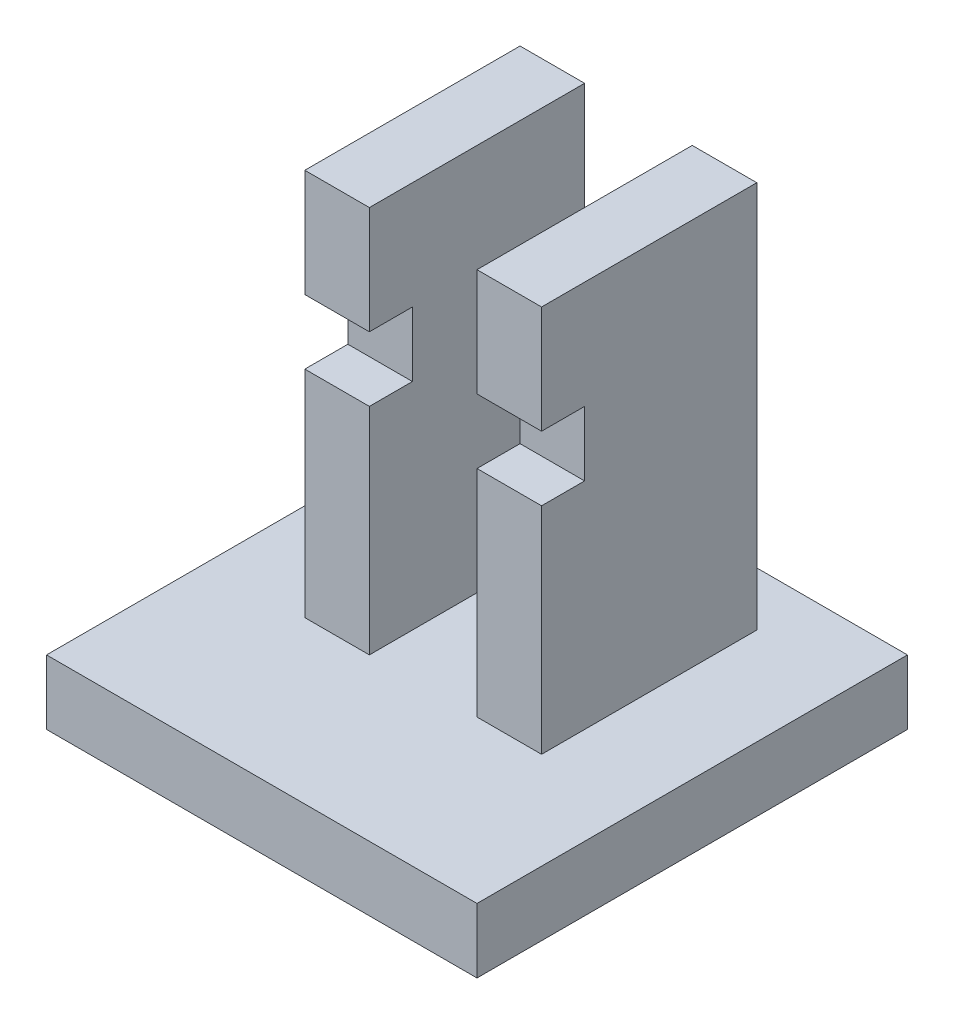
ISO-10303-21;
HEADER;
FILE_DESCRIPTION(('STEP AP214'),'2;1');
FILE_NAME('part.step','',(''),(''),'','','');
FILE_SCHEMA(('AUTOMOTIVE_DESIGN { 1 0 10303 214 1 1 1 1 }'));
ENDSEC;
DATA;
#1=APPLICATION_CONTEXT('core data for automotive mechanical design processes');
#2=APPLICATION_PROTOCOL_DEFINITION('international standard','automotive_design',2000,#1);
#3=PRODUCT_CONTEXT('',#1,'mechanical');
#4=PRODUCT('Part','Part','',(#3));
#5=PRODUCT_RELATED_PRODUCT_CATEGORY('part','',(#4));
#6=PRODUCT_DEFINITION_FORMATION('','',#4);
#7=PRODUCT_DEFINITION_CONTEXT('part definition',#1,'design');
#8=PRODUCT_DEFINITION('design','',#6,#7);
#9=PRODUCT_DEFINITION_SHAPE('','',#8);
#10=(LENGTH_UNIT() NAMED_UNIT(*) SI_UNIT(.MILLI.,.METRE.));
#11=(NAMED_UNIT(*) PLANE_ANGLE_UNIT() SI_UNIT($,.RADIAN.));
#12=(NAMED_UNIT(*) SI_UNIT($,.STERADIAN.) SOLID_ANGLE_UNIT());
#13=UNCERTAINTY_MEASURE_WITH_UNIT(LENGTH_MEASURE(1.E-05),#10,'distance_accuracy_value','');
#14=(GEOMETRIC_REPRESENTATION_CONTEXT(3) GLOBAL_UNCERTAINTY_ASSIGNED_CONTEXT((#13)) GLOBAL_UNIT_ASSIGNED_CONTEXT((#10,
#11,#12)) REPRESENTATION_CONTEXT('',''));
#15=CARTESIAN_POINT('',(0.,0.,0.));
#16=DIRECTION('',(0.,0.,1.));
#17=DIRECTION('',(1.,0.,0.));
#18=AXIS2_PLACEMENT_3D('',#15,#16,#17);
#19=CARTESIAN_POINT('',(-5.5,18.,5.));
#20=DIRECTION('',(0.,0.,-1.));
#21=DIRECTION('',(-1.,0.,0.));
#22=AXIS2_PLACEMENT_3D('',#19,#20,#21);
#23=PLANE('',#22);
#24=DIRECTION('',(0.,-1.,0.));
#25=VECTOR('',#24,1.);
#26=CARTESIAN_POINT('',(-5.5,18.,5.));
#27=LINE('',#26,#25);
#28=CARTESIAN_POINT('',(-5.5,18.,5.));
#29=VERTEX_POINT('',#28);
#30=CARTESIAN_POINT('',(-5.5,13.,5.));
#31=VERTEX_POINT('',#30);
#32=EDGE_CURVE('E303',#29,#31,#27,.T.);
#33=ORIENTED_EDGE('',*,*,#32,.T.);
#34=DIRECTION('',(-1.,0.,0.));
#35=VECTOR('',#34,1.);
#36=CARTESIAN_POINT('',(-5.5,13.,5.));
#37=LINE('',#36,#35);
#38=CARTESIAN_POINT('',(-2.5,13.,5.));
#39=VERTEX_POINT('',#38);
#40=EDGE_CURVE('E339',#39,#31,#37,.T.);
#41=ORIENTED_EDGE('',*,*,#40,.F.);
#42=DIRECTION('',(0.,-1.,0.));
#43=VECTOR('',#42,1.);
#44=CARTESIAN_POINT('',(-2.5,18.,5.));
#45=LINE('',#44,#43);
#46=CARTESIAN_POINT('',(-2.5,18.,5.));
#47=VERTEX_POINT('',#46);
#48=EDGE_CURVE('E300',#47,#39,#45,.T.);
#49=ORIENTED_EDGE('',*,*,#48,.F.);
#50=DIRECTION('',(1.,0.,0.));
#51=VECTOR('',#50,1.);
#52=CARTESIAN_POINT('',(-5.5,18.,5.));
#53=LINE('',#52,#51);
#54=EDGE_CURVE('E288',#29,#47,#53,.T.);
#55=ORIENTED_EDGE('',*,*,#54,.F.);
#56=EDGE_LOOP('',(#33,#41,#49,#55));
#57=FACE_BOUND('',#56,.T.);
#58=ADVANCED_FACE('F35',(#57),#23,.F.);
#59=CARTESIAN_POINT('',(2.5,18.,5.));
#60=DIRECTION('',(0.,0.,-1.));
#61=DIRECTION('',(-1.,0.,0.));
#62=AXIS2_PLACEMENT_3D('',#59,#60,#61);
#63=PLANE('',#62);
#64=DIRECTION('',(0.,-1.,0.));
#65=VECTOR('',#64,1.);
#66=CARTESIAN_POINT('',(2.5,18.,5.));
#67=LINE('',#66,#65);
#68=CARTESIAN_POINT('',(2.5,18.,5.));
#69=VERTEX_POINT('',#68);
#70=CARTESIAN_POINT('',(2.5,13.,5.));
#71=VERTEX_POINT('',#70);
#72=EDGE_CURVE('E241',#69,#71,#67,.T.);
#73=ORIENTED_EDGE('',*,*,#72,.T.);
#74=CARTESIAN_POINT('',(5.5,13.,5.));
#75=VERTEX_POINT('',#74);
#76=EDGE_CURVE('E188',#75,#71,#37,.T.);
#77=ORIENTED_EDGE('',*,*,#76,.F.);
#78=DIRECTION('',(0.,-1.,0.));
#79=VECTOR('',#78,1.);
#80=CARTESIAN_POINT('',(5.5,18.,5.));
#81=LINE('',#80,#79);
#82=CARTESIAN_POINT('',(5.5,18.,5.));
#83=VERTEX_POINT('',#82);
#84=EDGE_CURVE('E237',#83,#75,#81,.T.);
#85=ORIENTED_EDGE('',*,*,#84,.F.);
#86=DIRECTION('',(1.,0.,0.));
#87=VECTOR('',#86,1.);
#88=CARTESIAN_POINT('',(2.5,18.,5.));
#89=LINE('',#88,#87);
#90=EDGE_CURVE('E224',#69,#83,#89,.T.);
#91=ORIENTED_EDGE('',*,*,#90,.F.);
#92=EDGE_LOOP('',(#73,#77,#85,#91));
#93=FACE_BOUND('',#92,.T.);
#94=ADVANCED_FACE('F347',(#93),#63,.F.);
#95=CARTESIAN_POINT('',(0.,0.,0.));
#96=DIRECTION('',(0.,-1.,0.));
#97=DIRECTION('',(0.,0.,-1.));
#98=AXIS2_PLACEMENT_3D('',#95,#96,#97);
#99=PLANE('',#98);
#100=DIRECTION('',(-1.,0.,0.));
#101=VECTOR('',#100,1.);
#102=CARTESIAN_POINT('',(-5.5,0.,-5.));
#103=LINE('',#102,#101);
#104=CARTESIAN_POINT('',(-2.5,0.,-5.));
#105=VERTEX_POINT('',#104);
#106=CARTESIAN_POINT('',(-5.5,0.,-5.));
#107=VERTEX_POINT('',#106);
#108=EDGE_CURVE('E293',#105,#107,#103,.T.);
#109=ORIENTED_EDGE('',*,*,#108,.F.);
#110=DIRECTION('',(0.,0.,-1.));
#111=VECTOR('',#110,1.);
#112=CARTESIAN_POINT('',(-2.5,0.,5.));
#113=LINE('',#112,#111);
#114=CARTESIAN_POINT('',(-2.5,0.,5.));
#115=VERTEX_POINT('',#114);
#116=EDGE_CURVE('E279',#115,#105,#113,.T.);
#117=ORIENTED_EDGE('',*,*,#116,.F.);
#118=DIRECTION('',(1.,0.,0.));
#119=VECTOR('',#118,1.);
#120=CARTESIAN_POINT('',(-5.5,0.,5.));
#121=LINE('',#120,#119);
#122=CARTESIAN_POINT('',(-5.5,0.,5.));
#123=VERTEX_POINT('',#122);
#124=EDGE_CURVE('E284',#123,#115,#121,.T.);
#125=ORIENTED_EDGE('',*,*,#124,.F.);
#126=DIRECTION('',(0.,0.,1.));
#127=VECTOR('',#126,1.);
#128=CARTESIAN_POINT('',(-5.5,0.,5.));
#129=LINE('',#128,#127);
#130=EDGE_CURVE('E296',#107,#123,#129,.T.);
#131=ORIENTED_EDGE('',*,*,#130,.F.);
#132=EDGE_LOOP('',(#109,#117,#125,#131));
#133=FACE_BOUND('',#132,.T.);
#134=DIRECTION('',(0.,0.,1.));
#135=VECTOR('',#134,1.);
#136=CARTESIAN_POINT('',(-10.,0.,0.));
#137=LINE('',#136,#135);
#138=CARTESIAN_POINT('',(-10.,0.,-7.5));
#139=VERTEX_POINT('',#138);
#140=CARTESIAN_POINT('',(-10.,0.,12.5));
#141=VERTEX_POINT('',#140);
#142=EDGE_CURVE('E250',#139,#141,#137,.T.);
#143=ORIENTED_EDGE('',*,*,#142,.T.);
#144=DIRECTION('',(-1.,0.,0.));
#145=VECTOR('',#144,1.);
#146=CARTESIAN_POINT('',(0.,0.,12.5));
#147=LINE('',#146,#145);
#148=CARTESIAN_POINT('',(10.,0.,12.5));
#149=VERTEX_POINT('',#148);
#150=EDGE_CURVE('E255',#149,#141,#147,.T.);
#151=ORIENTED_EDGE('',*,*,#150,.F.);
#152=DIRECTION('',(0.,0.,1.));
#153=VECTOR('',#152,1.);
#154=CARTESIAN_POINT('',(10.,0.,0.));
#155=LINE('',#154,#153);
#156=CARTESIAN_POINT('',(10.,0.,-7.5));
#157=VERTEX_POINT('',#156);
#158=EDGE_CURVE('E266',#157,#149,#155,.T.);
#159=ORIENTED_EDGE('',*,*,#158,.F.);
#160=DIRECTION('',(1.,0.,0.));
#161=VECTOR('',#160,1.);
#162=CARTESIAN_POINT('',(0.,0.,-7.5));
#163=LINE('',#162,#161);
#164=EDGE_CURVE('E264',#139,#157,#163,.T.);
#165=ORIENTED_EDGE('',*,*,#164,.F.);
#166=EDGE_LOOP('',(#143,#151,#159,#165));
#167=FACE_BOUND('',#166,.T.);
#168=DIRECTION('',(0.,0.,-1.));
#169=VECTOR('',#168,1.);
#170=CARTESIAN_POINT('',(5.5,0.,5.));
#171=LINE('',#170,#169);
#172=CARTESIAN_POINT('',(5.5,0.,5.));
#173=VERTEX_POINT('',#172);
#174=CARTESIAN_POINT('',(5.5,0.,-5.));
#175=VERTEX_POINT('',#174);
#176=EDGE_CURVE('E215',#173,#175,#171,.T.);
#177=ORIENTED_EDGE('',*,*,#176,.F.);
#178=DIRECTION('',(1.,0.,0.));
#179=VECTOR('',#178,1.);
#180=CARTESIAN_POINT('',(2.5,0.,5.));
#181=LINE('',#180,#179);
#182=CARTESIAN_POINT('',(2.5,0.,5.));
#183=VERTEX_POINT('',#182);
#184=EDGE_CURVE('E220',#183,#173,#181,.T.);
#185=ORIENTED_EDGE('',*,*,#184,.F.);
#186=DIRECTION('',(0.,0.,1.));
#187=VECTOR('',#186,1.);
#188=CARTESIAN_POINT('',(2.5,0.,5.));
#189=LINE('',#188,#187);
#190=CARTESIAN_POINT('',(2.5,0.,-5.));
#191=VERTEX_POINT('',#190);
#192=EDGE_CURVE('E232',#191,#183,#189,.T.);
#193=ORIENTED_EDGE('',*,*,#192,.F.);
#194=DIRECTION('',(-1.,0.,0.));
#195=VECTOR('',#194,1.);
#196=CARTESIAN_POINT('',(2.5,0.,-5.));
#197=LINE('',#196,#195);
#198=EDGE_CURVE('E229',#175,#191,#197,.T.);
#199=ORIENTED_EDGE('',*,*,#198,.F.);
#200=EDGE_LOOP('',(#177,#185,#193,#199));
#201=FACE_BOUND('',#200,.T.);
#202=ADVANCED_FACE('F324',(#133,#167,#201),#99,.F.);
#203=CARTESIAN_POINT('',(-2.5,18.,5.));
#204=DIRECTION('',(-1.,0.,0.));
#205=DIRECTION('',(0.,0.,1.));
#206=AXIS2_PLACEMENT_3D('',#203,#204,#205);
#207=PLANE('',#206);
#208=ORIENTED_EDGE('',*,*,#48,.T.);
#209=DIRECTION('',(0.,0.,-1.));
#210=VECTOR('',#209,1.);
#211=CARTESIAN_POINT('',(-2.5,13.,5.));
#212=LINE('',#211,#210);
#213=CARTESIAN_POINT('',(-2.5,13.,3.));
#214=VERTEX_POINT('',#213);
#215=EDGE_CURVE('E210',#39,#214,#212,.T.);
#216=ORIENTED_EDGE('',*,*,#215,.T.);
#217=DIRECTION('',(0.,1.,0.));
#218=VECTOR('',#217,1.);
#219=CARTESIAN_POINT('',(-2.5,18.,3.));
#220=LINE('',#219,#218);
#221=CARTESIAN_POINT('',(-2.5,10.,3.));
#222=VERTEX_POINT('',#221);
#223=EDGE_CURVE('E213',#222,#214,#220,.T.);
#224=ORIENTED_EDGE('',*,*,#223,.F.);
#225=DIRECTION('',(0.,0.,1.));
#226=VECTOR('',#225,1.);
#227=CARTESIAN_POINT('',(-2.5,10.,5.));
#228=LINE('',#227,#226);
#229=CARTESIAN_POINT('',(-2.5,10.,5.));
#230=VERTEX_POINT('',#229);
#231=EDGE_CURVE('E174',#222,#230,#228,.T.);
#232=ORIENTED_EDGE('',*,*,#231,.T.);
#233=EDGE_CURVE('E290',#230,#115,#45,.T.);
#234=ORIENTED_EDGE('',*,*,#233,.T.);
#235=ORIENTED_EDGE('',*,*,#116,.T.);
#236=DIRECTION('',(0.,-1.,0.));
#237=VECTOR('',#236,1.);
#238=CARTESIAN_POINT('',(-2.5,18.,-5.));
#239=LINE('',#238,#237);
#240=CARTESIAN_POINT('',(-2.5,18.,-5.));
#241=VERTEX_POINT('',#240);
#242=EDGE_CURVE('E309',#241,#105,#239,.T.);
#243=ORIENTED_EDGE('',*,*,#242,.F.);
#244=DIRECTION('',(0.,0.,-1.));
#245=VECTOR('',#244,1.);
#246=CARTESIAN_POINT('',(-2.5,18.,5.));
#247=LINE('',#246,#245);
#248=EDGE_CURVE('E280',#47,#241,#247,.T.);
#249=ORIENTED_EDGE('',*,*,#248,.F.);
#250=EDGE_LOOP('',(#208,#216,#224,#232,#234,#235,#243,#249));
#251=FACE_BOUND('',#250,.T.);
#252=ADVANCED_FACE('F37',(#251),#207,.F.);
#253=CARTESIAN_POINT('',(-5.5,18.,-5.));
#254=DIRECTION('',(0.,0.,1.));
#255=DIRECTION('',(1.,0.,0.));
#256=AXIS2_PLACEMENT_3D('',#253,#254,#255);
#257=PLANE('',#256);
#258=ORIENTED_EDGE('',*,*,#108,.T.);
#259=DIRECTION('',(0.,-1.,0.));
#260=VECTOR('',#259,1.);
#261=CARTESIAN_POINT('',(-5.5,18.,-5.));
#262=LINE('',#261,#260);
#263=CARTESIAN_POINT('',(-5.5,18.,-5.));
#264=VERTEX_POINT('',#263);
#265=EDGE_CURVE('E306',#264,#107,#262,.T.);
#266=ORIENTED_EDGE('',*,*,#265,.F.);
#267=DIRECTION('',(-1.,0.,0.));
#268=VECTOR('',#267,1.);
#269=CARTESIAN_POINT('',(-5.5,18.,-5.));
#270=LINE('',#269,#268);
#271=EDGE_CURVE('E283',#241,#264,#270,.T.);
#272=ORIENTED_EDGE('',*,*,#271,.F.);
#273=ORIENTED_EDGE('',*,*,#242,.T.);
#274=EDGE_LOOP('',(#258,#266,#272,#273));
#275=FACE_BOUND('',#274,.T.);
#276=ADVANCED_FACE('F380',(#275),#257,.F.);
#277=CARTESIAN_POINT('',(-5.5,18.,5.));
#278=DIRECTION('',(1.,0.,0.));
#279=DIRECTION('',(0.,0.,-1.));
#280=AXIS2_PLACEMENT_3D('',#277,#278,#279);
#281=PLANE('',#280);
#282=DIRECTION('',(0.,-1.,0.));
#283=VECTOR('',#282,1.);
#284=CARTESIAN_POINT('',(-5.5,13.,3.));
#285=LINE('',#284,#283);
#286=CARTESIAN_POINT('',(-5.5,13.,3.));
#287=VERTEX_POINT('',#286);
#288=CARTESIAN_POINT('',(-5.5,10.,3.));
#289=VERTEX_POINT('',#288);
#290=EDGE_CURVE('E181',#287,#289,#285,.T.);
#291=ORIENTED_EDGE('',*,*,#290,.F.);
#292=DIRECTION('',(0.,0.,1.));
#293=VECTOR('',#292,1.);
#294=CARTESIAN_POINT('',(-5.5,13.,3.));
#295=LINE('',#294,#293);
#296=EDGE_CURVE('E205',#287,#31,#295,.T.);
#297=ORIENTED_EDGE('',*,*,#296,.T.);
#298=ORIENTED_EDGE('',*,*,#32,.F.);
#299=DIRECTION('',(0.,0.,1.));
#300=VECTOR('',#299,1.);
#301=CARTESIAN_POINT('',(-5.5,18.,5.));
#302=LINE('',#301,#300);
#303=EDGE_CURVE('E286',#264,#29,#302,.T.);
#304=ORIENTED_EDGE('',*,*,#303,.F.);
#305=ORIENTED_EDGE('',*,*,#265,.T.);
#306=ORIENTED_EDGE('',*,*,#130,.T.);
#307=CARTESIAN_POINT('',(-5.5,10.,5.));
#308=VERTEX_POINT('',#307);
#309=EDGE_CURVE('E193',#308,#123,#27,.T.);
#310=ORIENTED_EDGE('',*,*,#309,.F.);
#311=DIRECTION('',(0.,0.,1.));
#312=VECTOR('',#311,1.);
#313=CARTESIAN_POINT('',(-5.5,10.,3.));
#314=LINE('',#313,#312);
#315=EDGE_CURVE('E50',#289,#308,#314,.T.);
#316=ORIENTED_EDGE('',*,*,#315,.F.);
#317=EDGE_LOOP('',(#291,#297,#298,#304,#305,#306,#310,#316));
#318=FACE_BOUND('',#317,.T.);
#319=ADVANCED_FACE('F191',(#318),#281,.F.);
#320=ORIENTED_EDGE('',*,*,#233,.F.);
#321=DIRECTION('',(1.,0.,0.));
#322=VECTOR('',#321,1.);
#323=CARTESIAN_POINT('',(-5.5,10.,5.));
#324=LINE('',#323,#322);
#325=EDGE_CURVE('E337',#308,#230,#324,.T.);
#326=ORIENTED_EDGE('',*,*,#325,.F.);
#327=ORIENTED_EDGE('',*,*,#309,.T.);
#328=ORIENTED_EDGE('',*,*,#124,.T.);
#329=EDGE_LOOP('',(#320,#326,#327,#328));
#330=FACE_BOUND('',#329,.T.);
#331=ADVANCED_FACE('F364',(#330),#23,.F.);
#332=CARTESIAN_POINT('',(0.,18.,0.));
#333=DIRECTION('',(0.,-1.,0.));
#334=DIRECTION('',(0.,0.,-1.));
#335=AXIS2_PLACEMENT_3D('',#332,#333,#334);
#336=PLANE('',#335);
#337=ORIENTED_EDGE('',*,*,#248,.T.);
#338=ORIENTED_EDGE('',*,*,#271,.T.);
#339=ORIENTED_EDGE('',*,*,#303,.T.);
#340=ORIENTED_EDGE('',*,*,#54,.T.);
#341=EDGE_LOOP('',(#337,#338,#339,#340));
#342=FACE_BOUND('',#341,.T.);
#343=ADVANCED_FACE('F372',(#342),#336,.F.);
#344=CARTESIAN_POINT('',(-10.,-3.,0.));
#345=DIRECTION('',(-1.,0.,0.));
#346=DIRECTION('',(0.,0.,1.));
#347=AXIS2_PLACEMENT_3D('',#344,#345,#346);
#348=PLANE('',#347);
#349=ORIENTED_EDGE('',*,*,#142,.F.);
#350=DIRECTION('',(0.,1.,0.));
#351=VECTOR('',#350,1.);
#352=CARTESIAN_POINT('',(-10.,-3.,-7.5));
#353=LINE('',#352,#351);
#354=CARTESIAN_POINT('',(-10.,-3.,-7.5));
#355=VERTEX_POINT('',#354);
#356=EDGE_CURVE('E277',#355,#139,#353,.T.);
#357=ORIENTED_EDGE('',*,*,#356,.F.);
#358=DIRECTION('',(0.,0.,1.));
#359=VECTOR('',#358,1.);
#360=CARTESIAN_POINT('',(-10.,-3.,0.));
#361=LINE('',#360,#359);
#362=CARTESIAN_POINT('',(-10.,-3.,12.5));
#363=VERTEX_POINT('',#362);
#364=EDGE_CURVE('E251',#355,#363,#361,.T.);
#365=ORIENTED_EDGE('',*,*,#364,.T.);
#366=DIRECTION('',(0.,1.,0.));
#367=VECTOR('',#366,1.);
#368=CARTESIAN_POINT('',(-10.,-3.,12.5));
#369=LINE('',#368,#367);
#370=EDGE_CURVE('E261',#363,#141,#369,.T.);
#371=ORIENTED_EDGE('',*,*,#370,.T.);
#372=EDGE_LOOP('',(#349,#357,#365,#371));
#373=FACE_BOUND('',#372,.T.);
#374=ADVANCED_FACE('F378',(#373),#348,.T.);
#375=CARTESIAN_POINT('',(0.,-3.,-7.5));
#376=DIRECTION('',(0.,0.,1.));
#377=DIRECTION('',(1.,0.,0.));
#378=AXIS2_PLACEMENT_3D('',#375,#376,#377);
#379=PLANE('',#378);
#380=ORIENTED_EDGE('',*,*,#164,.T.);
#381=DIRECTION('',(0.,1.,0.));
#382=VECTOR('',#381,1.);
#383=CARTESIAN_POINT('',(10.,-3.,-7.5));
#384=LINE('',#383,#382);
#385=CARTESIAN_POINT('',(10.,-3.,-7.5));
#386=VERTEX_POINT('',#385);
#387=EDGE_CURVE('E274',#386,#157,#384,.T.);
#388=ORIENTED_EDGE('',*,*,#387,.F.);
#389=DIRECTION('',(1.,0.,0.));
#390=VECTOR('',#389,1.);
#391=CARTESIAN_POINT('',(0.,-3.,-7.5));
#392=LINE('',#391,#390);
#393=EDGE_CURVE('E254',#355,#386,#392,.T.);
#394=ORIENTED_EDGE('',*,*,#393,.F.);
#395=ORIENTED_EDGE('',*,*,#356,.T.);
#396=EDGE_LOOP('',(#380,#388,#394,#395));
#397=FACE_BOUND('',#396,.T.);
#398=ADVANCED_FACE('F425',(#397),#379,.F.);
#399=CARTESIAN_POINT('',(10.,-3.,0.));
#400=DIRECTION('',(-1.,0.,0.));
#401=DIRECTION('',(0.,0.,1.));
#402=AXIS2_PLACEMENT_3D('',#399,#400,#401);
#403=PLANE('',#402);
#404=ORIENTED_EDGE('',*,*,#158,.T.);
#405=DIRECTION('',(0.,1.,0.));
#406=VECTOR('',#405,1.);
#407=CARTESIAN_POINT('',(10.,-3.,12.5));
#408=LINE('',#407,#406);
#409=CARTESIAN_POINT('',(10.,-3.,12.5));
#410=VERTEX_POINT('',#409);
#411=EDGE_CURVE('E271',#410,#149,#408,.T.);
#412=ORIENTED_EDGE('',*,*,#411,.F.);
#413=DIRECTION('',(0.,0.,1.));
#414=VECTOR('',#413,1.);
#415=CARTESIAN_POINT('',(10.,-3.,0.));
#416=LINE('',#415,#414);
#417=EDGE_CURVE('E257',#386,#410,#416,.T.);
#418=ORIENTED_EDGE('',*,*,#417,.F.);
#419=ORIENTED_EDGE('',*,*,#387,.T.);
#420=EDGE_LOOP('',(#404,#412,#418,#419));
#421=FACE_BOUND('',#420,.T.);
#422=ADVANCED_FACE('F421',(#421),#403,.F.);
#423=CARTESIAN_POINT('',(0.,-3.,12.5));
#424=DIRECTION('',(0.,0.,-1.));
#425=DIRECTION('',(-1.,0.,0.));
#426=AXIS2_PLACEMENT_3D('',#423,#424,#425);
#427=PLANE('',#426);
#428=ORIENTED_EDGE('',*,*,#150,.T.);
#429=ORIENTED_EDGE('',*,*,#370,.F.);
#430=DIRECTION('',(-1.,0.,0.));
#431=VECTOR('',#430,1.);
#432=CARTESIAN_POINT('',(0.,-3.,12.5));
#433=LINE('',#432,#431);
#434=EDGE_CURVE('E259',#410,#363,#433,.T.);
#435=ORIENTED_EDGE('',*,*,#434,.F.);
#436=ORIENTED_EDGE('',*,*,#411,.T.);
#437=EDGE_LOOP('',(#428,#429,#435,#436));
#438=FACE_BOUND('',#437,.T.);
#439=ADVANCED_FACE('F415',(#438),#427,.F.);
#440=CARTESIAN_POINT('',(0.,-3.,0.));
#441=DIRECTION('',(0.,-1.,0.));
#442=DIRECTION('',(0.,0.,-1.));
#443=AXIS2_PLACEMENT_3D('',#440,#441,#442);
#444=PLANE('',#443);
#445=ORIENTED_EDGE('',*,*,#364,.F.);
#446=ORIENTED_EDGE('',*,*,#393,.T.);
#447=ORIENTED_EDGE('',*,*,#417,.T.);
#448=ORIENTED_EDGE('',*,*,#434,.T.);
#449=EDGE_LOOP('',(#445,#446,#447,#448));
#450=FACE_BOUND('',#449,.T.);
#451=ADVANCED_FACE('F412',(#450),#444,.T.);
#452=CARTESIAN_POINT('',(5.5,18.,5.));
#453=DIRECTION('',(-1.,0.,0.));
#454=DIRECTION('',(0.,0.,1.));
#455=AXIS2_PLACEMENT_3D('',#452,#453,#454);
#456=PLANE('',#455);
#457=ORIENTED_EDGE('',*,*,#84,.T.);
#458=DIRECTION('',(0.,0.,1.));
#459=VECTOR('',#458,1.);
#460=CARTESIAN_POINT('',(5.5,13.,3.));
#461=LINE('',#460,#459);
#462=CARTESIAN_POINT('',(5.5,13.,3.));
#463=VERTEX_POINT('',#462);
#464=EDGE_CURVE('E198',#463,#75,#461,.T.);
#465=ORIENTED_EDGE('',*,*,#464,.F.);
#466=DIRECTION('',(0.,1.,0.));
#467=VECTOR('',#466,1.);
#468=CARTESIAN_POINT('',(5.5,13.,3.));
#469=LINE('',#468,#467);
#470=CARTESIAN_POINT('',(5.5,10.,3.));
#471=VERTEX_POINT('',#470);
#472=EDGE_CURVE('E177',#471,#463,#469,.T.);
#473=ORIENTED_EDGE('',*,*,#472,.F.);
#474=DIRECTION('',(0.,0.,1.));
#475=VECTOR('',#474,1.);
#476=CARTESIAN_POINT('',(5.5,10.,3.));
#477=LINE('',#476,#475);
#478=CARTESIAN_POINT('',(5.5,10.,5.));
#479=VERTEX_POINT('',#478);
#480=EDGE_CURVE('E194',#471,#479,#477,.T.);
#481=ORIENTED_EDGE('',*,*,#480,.T.);
#482=EDGE_CURVE('E226',#479,#173,#81,.T.);
#483=ORIENTED_EDGE('',*,*,#482,.T.);
#484=ORIENTED_EDGE('',*,*,#176,.T.);
#485=DIRECTION('',(0.,-1.,0.));
#486=VECTOR('',#485,1.);
#487=CARTESIAN_POINT('',(5.5,18.,-5.));
#488=LINE('',#487,#486);
#489=CARTESIAN_POINT('',(5.5,18.,-5.));
#490=VERTEX_POINT('',#489);
#491=EDGE_CURVE('E247',#490,#175,#488,.T.);
#492=ORIENTED_EDGE('',*,*,#491,.F.);
#493=DIRECTION('',(0.,0.,-1.));
#494=VECTOR('',#493,1.);
#495=CARTESIAN_POINT('',(5.5,18.,5.));
#496=LINE('',#495,#494);
#497=EDGE_CURVE('E216',#83,#490,#496,.T.);
#498=ORIENTED_EDGE('',*,*,#497,.F.);
#499=EDGE_LOOP('',(#457,#465,#473,#481,#483,#484,#492,#498));
#500=FACE_BOUND('',#499,.T.);
#501=ADVANCED_FACE('F330',(#500),#456,.F.);
#502=CARTESIAN_POINT('',(2.5,18.,-5.));
#503=DIRECTION('',(0.,0.,1.));
#504=DIRECTION('',(1.,0.,0.));
#505=AXIS2_PLACEMENT_3D('',#502,#503,#504);
#506=PLANE('',#505);
#507=ORIENTED_EDGE('',*,*,#198,.T.);
#508=DIRECTION('',(0.,-1.,0.));
#509=VECTOR('',#508,1.);
#510=CARTESIAN_POINT('',(2.5,18.,-5.));
#511=LINE('',#510,#509);
#512=CARTESIAN_POINT('',(2.5,18.,-5.));
#513=VERTEX_POINT('',#512);
#514=EDGE_CURVE('E244',#513,#191,#511,.T.);
#515=ORIENTED_EDGE('',*,*,#514,.F.);
#516=DIRECTION('',(-1.,0.,0.));
#517=VECTOR('',#516,1.);
#518=CARTESIAN_POINT('',(2.5,18.,-5.));
#519=LINE('',#518,#517);
#520=EDGE_CURVE('E219',#490,#513,#519,.T.);
#521=ORIENTED_EDGE('',*,*,#520,.F.);
#522=ORIENTED_EDGE('',*,*,#491,.T.);
#523=EDGE_LOOP('',(#507,#515,#521,#522));
#524=FACE_BOUND('',#523,.T.);
#525=ADVANCED_FACE('F326',(#524),#506,.F.);
#526=CARTESIAN_POINT('',(2.5,18.,5.));
#527=DIRECTION('',(1.,0.,0.));
#528=DIRECTION('',(0.,0.,-1.));
#529=AXIS2_PLACEMENT_3D('',#526,#527,#528);
#530=PLANE('',#529);
#531=DIRECTION('',(0.,-1.,0.));
#532=VECTOR('',#531,1.);
#533=CARTESIAN_POINT('',(2.5,18.,3.));
#534=LINE('',#533,#532);
#535=CARTESIAN_POINT('',(2.5,13.,3.));
#536=VERTEX_POINT('',#535);
#537=CARTESIAN_POINT('',(2.5,10.,3.));
#538=VERTEX_POINT('',#537);
#539=EDGE_CURVE('E11',#536,#538,#534,.T.);
#540=ORIENTED_EDGE('',*,*,#539,.F.);
#541=DIRECTION('',(0.,0.,1.));
#542=VECTOR('',#541,1.);
#543=CARTESIAN_POINT('',(2.5,13.,5.));
#544=LINE('',#543,#542);
#545=EDGE_CURVE('E207',#536,#71,#544,.T.);
#546=ORIENTED_EDGE('',*,*,#545,.T.);
#547=ORIENTED_EDGE('',*,*,#72,.F.);
#548=DIRECTION('',(0.,0.,1.));
#549=VECTOR('',#548,1.);
#550=CARTESIAN_POINT('',(2.5,18.,5.));
#551=LINE('',#550,#549);
#552=EDGE_CURVE('E222',#513,#69,#551,.T.);
#553=ORIENTED_EDGE('',*,*,#552,.F.);
#554=ORIENTED_EDGE('',*,*,#514,.T.);
#555=ORIENTED_EDGE('',*,*,#192,.T.);
#556=CARTESIAN_POINT('',(2.5,10.,5.));
#557=VERTEX_POINT('',#556);
#558=EDGE_CURVE('E240',#557,#183,#67,.T.);
#559=ORIENTED_EDGE('',*,*,#558,.F.);
#560=DIRECTION('',(0.,0.,-1.));
#561=VECTOR('',#560,1.);
#562=CARTESIAN_POINT('',(2.5,10.,5.));
#563=LINE('',#562,#561);
#564=EDGE_CURVE('E58',#557,#538,#563,.T.);
#565=ORIENTED_EDGE('',*,*,#564,.T.);
#566=EDGE_LOOP('',(#540,#546,#547,#553,#554,#555,#559,#565));
#567=FACE_BOUND('',#566,.T.);
#568=ADVANCED_FACE('F319',(#567),#530,.F.);
#569=ORIENTED_EDGE('',*,*,#482,.F.);
#570=DIRECTION('',(-1.,0.,0.));
#571=VECTOR('',#570,1.);
#572=CARTESIAN_POINT('',(2.5,10.,5.));
#573=LINE('',#572,#571);
#574=EDGE_CURVE('E43',#479,#557,#573,.T.);
#575=ORIENTED_EDGE('',*,*,#574,.T.);
#576=ORIENTED_EDGE('',*,*,#558,.T.);
#577=ORIENTED_EDGE('',*,*,#184,.T.);
#578=EDGE_LOOP('',(#569,#575,#576,#577));
#579=FACE_BOUND('',#578,.T.);
#580=ADVANCED_FACE('F314',(#579),#63,.F.);
#581=CARTESIAN_POINT('',(0.,18.,0.));
#582=DIRECTION('',(0.,-1.,0.));
#583=DIRECTION('',(0.,0.,-1.));
#584=AXIS2_PLACEMENT_3D('',#581,#582,#583);
#585=PLANE('',#584);
#586=ORIENTED_EDGE('',*,*,#497,.T.);
#587=ORIENTED_EDGE('',*,*,#520,.T.);
#588=ORIENTED_EDGE('',*,*,#552,.T.);
#589=ORIENTED_EDGE('',*,*,#90,.T.);
#590=EDGE_LOOP('',(#586,#587,#588,#589));
#591=FACE_BOUND('',#590,.T.);
#592=ADVANCED_FACE('F351',(#591),#585,.F.);
#593=CARTESIAN_POINT('',(-5.5,10.,3.));
#594=DIRECTION('',(0.,-1.,0.));
#595=DIRECTION('',(0.,0.,-1.));
#596=AXIS2_PLACEMENT_3D('',#593,#594,#595);
#597=PLANE('',#596);
#598=ORIENTED_EDGE('',*,*,#574,.F.);
#599=ORIENTED_EDGE('',*,*,#480,.F.);
#600=DIRECTION('',(1.,0.,0.));
#601=VECTOR('',#600,1.);
#602=CARTESIAN_POINT('',(-5.5,10.,3.));
#603=LINE('',#602,#601);
#604=EDGE_CURVE('E178',#538,#471,#603,.T.);
#605=ORIENTED_EDGE('',*,*,#604,.F.);
#606=ORIENTED_EDGE('',*,*,#564,.F.);
#607=EDGE_LOOP('',(#598,#599,#605,#606));
#608=FACE_BOUND('',#607,.T.);
#609=ADVANCED_FACE('F333',(#608),#597,.F.);
#610=CARTESIAN_POINT('',(-5.5,13.,3.));
#611=DIRECTION('',(0.,1.,0.));
#612=DIRECTION('',(0.,0.,1.));
#613=AXIS2_PLACEMENT_3D('',#610,#611,#612);
#614=PLANE('',#613);
#615=DIRECTION('',(-1.,0.,0.));
#616=VECTOR('',#615,1.);
#617=CARTESIAN_POINT('',(-5.5,13.,3.));
#618=LINE('',#617,#616);
#619=EDGE_CURVE('E195',#463,#536,#618,.T.);
#620=ORIENTED_EDGE('',*,*,#619,.F.);
#621=ORIENTED_EDGE('',*,*,#464,.T.);
#622=ORIENTED_EDGE('',*,*,#76,.T.);
#623=ORIENTED_EDGE('',*,*,#545,.F.);
#624=EDGE_LOOP('',(#620,#621,#622,#623));
#625=FACE_BOUND('',#624,.T.);
#626=ADVANCED_FACE('F344',(#625),#614,.F.);
#627=CARTESIAN_POINT('',(0.,0.,3.));
#628=DIRECTION('',(0.,0.,1.));
#629=DIRECTION('',(1.,0.,0.));
#630=AXIS2_PLACEMENT_3D('',#627,#628,#629);
#631=PLANE('',#630);
#632=ORIENTED_EDGE('',*,*,#539,.T.);
#633=ORIENTED_EDGE('',*,*,#604,.T.);
#634=ORIENTED_EDGE('',*,*,#472,.T.);
#635=ORIENTED_EDGE('',*,*,#619,.T.);
#636=EDGE_LOOP('',(#632,#633,#634,#635));
#637=FACE_BOUND('',#636,.T.);
#638=ADVANCED_FACE('F352',(#637),#631,.T.);
#639=ORIENTED_EDGE('',*,*,#223,.T.);
#640=EDGE_CURVE('E184',#214,#287,#618,.T.);
#641=ORIENTED_EDGE('',*,*,#640,.T.);
#642=ORIENTED_EDGE('',*,*,#290,.T.);
#643=EDGE_CURVE('E170',#289,#222,#603,.T.);
#644=ORIENTED_EDGE('',*,*,#643,.T.);
#645=EDGE_LOOP('',(#639,#641,#642,#644));
#646=FACE_BOUND('',#645,.T.);
#647=ADVANCED_FACE('F182',(#646),#631,.T.);
#648=ORIENTED_EDGE('',*,*,#40,.T.);
#649=ORIENTED_EDGE('',*,*,#296,.F.);
#650=ORIENTED_EDGE('',*,*,#640,.F.);
#651=ORIENTED_EDGE('',*,*,#215,.F.);
#652=EDGE_LOOP('',(#648,#649,#650,#651));
#653=FACE_BOUND('',#652,.T.);
#654=ADVANCED_FACE('F359',(#653),#614,.F.);
#655=ORIENTED_EDGE('',*,*,#643,.F.);
#656=ORIENTED_EDGE('',*,*,#315,.T.);
#657=ORIENTED_EDGE('',*,*,#325,.T.);
#658=ORIENTED_EDGE('',*,*,#231,.F.);
#659=EDGE_LOOP('',(#655,#656,#657,#658));
#660=FACE_BOUND('',#659,.T.);
#661=ADVANCED_FACE('F172',(#660),#597,.F.);
#662=CLOSED_SHELL('',(#58,#94,#202,#252,#276,#319,#331,#343,#374,#398,#422,#439,#451,#501,#525,
#568,#580,#592,#609,#626,#638,#647,#654,#661));
#663=MANIFOLD_SOLID_BREP('B2',#662);
#664=ADVANCED_BREP_SHAPE_REPRESENTATION('',(#18,#663),#14);
#665=SHAPE_DEFINITION_REPRESENTATION(#9,#664);
ENDSEC;
END-ISO-10303-21;
